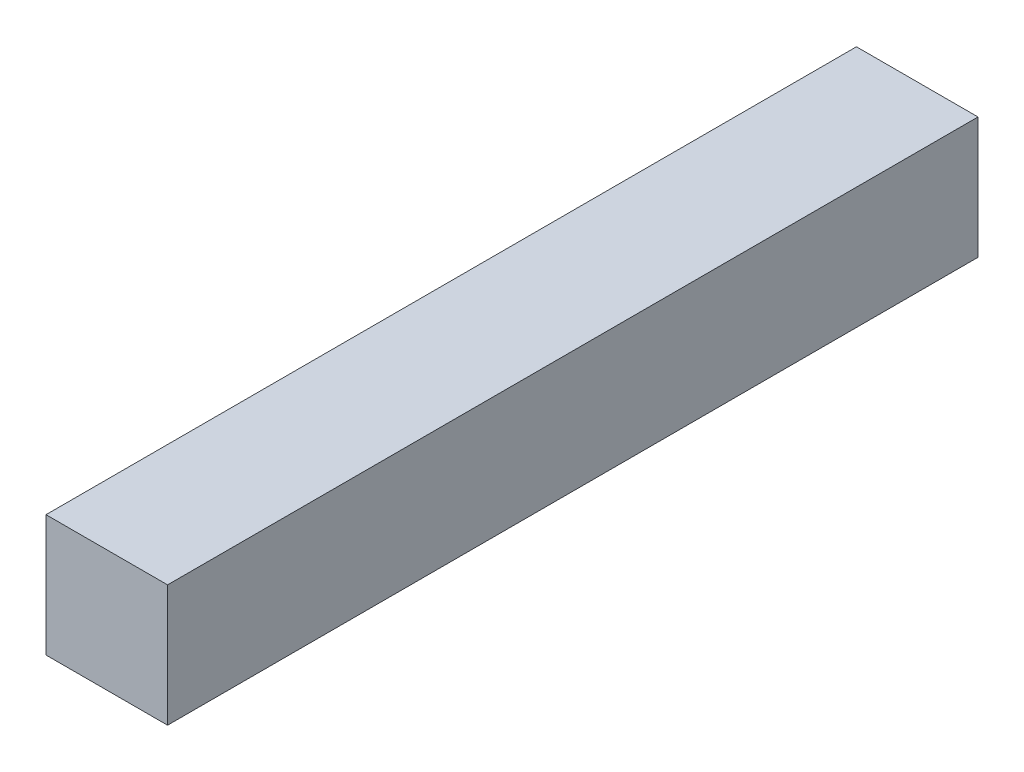
ISO-10303-21;
HEADER;
FILE_DESCRIPTION(('STEP AP214'),'2;1');
FILE_NAME('part.step','',(''),(''),'','','');
FILE_SCHEMA(('AUTOMOTIVE_DESIGN { 1 0 10303 214 1 1 1 1 }'));
ENDSEC;
DATA;
#1=APPLICATION_CONTEXT('core data for automotive mechanical design processes');
#2=APPLICATION_PROTOCOL_DEFINITION('international standard','automotive_design',2000,#1);
#3=PRODUCT_CONTEXT('',#1,'mechanical');
#4=PRODUCT('Part','Part','',(#3));
#5=PRODUCT_RELATED_PRODUCT_CATEGORY('part','',(#4));
#6=PRODUCT_DEFINITION_FORMATION('','',#4);
#7=PRODUCT_DEFINITION_CONTEXT('part definition',#1,'design');
#8=PRODUCT_DEFINITION('design','',#6,#7);
#9=PRODUCT_DEFINITION_SHAPE('','',#8);
#10=(LENGTH_UNIT() NAMED_UNIT(*) SI_UNIT(.MILLI.,.METRE.));
#11=(NAMED_UNIT(*) PLANE_ANGLE_UNIT() SI_UNIT($,.RADIAN.));
#12=(NAMED_UNIT(*) SI_UNIT($,.STERADIAN.) SOLID_ANGLE_UNIT());
#13=UNCERTAINTY_MEASURE_WITH_UNIT(LENGTH_MEASURE(1.E-05),#10,'distance_accuracy_value','');
#14=(GEOMETRIC_REPRESENTATION_CONTEXT(3) GLOBAL_UNCERTAINTY_ASSIGNED_CONTEXT((#13)) GLOBAL_UNIT_ASSIGNED_CONTEXT((#10,
#11,#12)) REPRESENTATION_CONTEXT('',''));
#15=CARTESIAN_POINT('',(0.,0.,0.));
#16=DIRECTION('',(0.,0.,1.));
#17=DIRECTION('',(1.,0.,0.));
#18=AXIS2_PLACEMENT_3D('',#15,#16,#17);
#19=CARTESIAN_POINT('',(-3.048,2.57628571428571,50.8));
#20=DIRECTION('',(1.,0.,0.));
#21=DIRECTION('',(0.,1.,0.));
#22=AXIS2_PLACEMENT_3D('',#19,#20,#21);
#23=PLANE('',#22);
#24=DIRECTION('',(0.,-1.,0.));
#25=VECTOR('',#24,1.);
#26=CARTESIAN_POINT('',(-3.048,2.57628571428571,0.));
#27=LINE('',#26,#25);
#28=CARTESIAN_POINT('',(-3.048,2.57628571428571,0.));
#29=VERTEX_POINT('',#28);
#30=CARTESIAN_POINT('',(-3.048,-5.04371428571429,0.));
#31=VERTEX_POINT('',#30);
#32=EDGE_CURVE('E107',#29,#31,#27,.T.);
#33=ORIENTED_EDGE('',*,*,#32,.T.);
#34=DIRECTION('',(0.,0.,-1.));
#35=VECTOR('',#34,1.);
#36=CARTESIAN_POINT('',(-3.048,-5.04371428571429,50.8));
#37=LINE('',#36,#35);
#38=CARTESIAN_POINT('',(-3.048,-5.04371428571429,50.8));
#39=VERTEX_POINT('',#38);
#40=EDGE_CURVE('E11',#39,#31,#37,.T.);
#41=ORIENTED_EDGE('',*,*,#40,.F.);
#42=DIRECTION('',(0.,-1.,0.));
#43=VECTOR('',#42,1.);
#44=CARTESIAN_POINT('',(-3.048,2.57628571428571,50.8));
#45=LINE('',#44,#43);
#46=CARTESIAN_POINT('',(-3.048,2.57628571428571,50.8));
#47=VERTEX_POINT('',#46);
#48=EDGE_CURVE('E91',#47,#39,#45,.T.);
#49=ORIENTED_EDGE('',*,*,#48,.F.);
#50=DIRECTION('',(0.,0.,-1.));
#51=VECTOR('',#50,1.);
#52=CARTESIAN_POINT('',(-3.048,2.57628571428571,50.8));
#53=LINE('',#52,#51);
#54=EDGE_CURVE('E103',#47,#29,#53,.T.);
#55=ORIENTED_EDGE('',*,*,#54,.T.);
#56=EDGE_LOOP('',(#33,#41,#49,#55));
#57=FACE_BOUND('',#56,.T.);
#58=ADVANCED_FACE('F39',(#57),#23,.F.);
#59=CARTESIAN_POINT('',(-3.048,-5.04371428571429,50.8));
#60=DIRECTION('',(0.,1.,0.));
#61=DIRECTION('',(0.,0.,1.));
#62=AXIS2_PLACEMENT_3D('',#59,#60,#61);
#63=PLANE('',#62);
#64=DIRECTION('',(1.,0.,0.));
#65=VECTOR('',#64,1.);
#66=CARTESIAN_POINT('',(-3.048,-5.04371428571429,0.));
#67=LINE('',#66,#65);
#68=CARTESIAN_POINT('',(4.572,-5.04371428571429,0.));
#69=VERTEX_POINT('',#68);
#70=EDGE_CURVE('E96',#31,#69,#67,.T.);
#71=ORIENTED_EDGE('',*,*,#70,.T.);
#72=DIRECTION('',(0.,0.,-1.));
#73=VECTOR('',#72,1.);
#74=CARTESIAN_POINT('',(4.572,-5.04371428571429,50.8));
#75=LINE('',#74,#73);
#76=CARTESIAN_POINT('',(4.572,-5.04371428571429,50.8));
#77=VERTEX_POINT('',#76);
#78=EDGE_CURVE('E48',#77,#69,#75,.T.);
#79=ORIENTED_EDGE('',*,*,#78,.F.);
#80=DIRECTION('',(1.,0.,0.));
#81=VECTOR('',#80,1.);
#82=CARTESIAN_POINT('',(-3.048,-5.04371428571429,50.8));
#83=LINE('',#82,#81);
#84=EDGE_CURVE('E86',#39,#77,#83,.T.);
#85=ORIENTED_EDGE('',*,*,#84,.F.);
#86=ORIENTED_EDGE('',*,*,#40,.T.);
#87=EDGE_LOOP('',(#71,#79,#85,#86));
#88=FACE_BOUND('',#87,.T.);
#89=ADVANCED_FACE('F95',(#88),#63,.F.);
#90=CARTESIAN_POINT('',(4.572,2.57628571428571,50.8));
#91=DIRECTION('',(-1.,0.,0.));
#92=DIRECTION('',(0.,-1.,0.));
#93=AXIS2_PLACEMENT_3D('',#90,#91,#92);
#94=PLANE('',#93);
#95=DIRECTION('',(0.,1.,0.));
#96=VECTOR('',#95,1.);
#97=CARTESIAN_POINT('',(4.572,2.57628571428571,0.));
#98=LINE('',#97,#96);
#99=CARTESIAN_POINT('',(4.572,2.57628571428571,0.));
#100=VERTEX_POINT('',#99);
#101=EDGE_CURVE('E73',#69,#100,#98,.T.);
#102=ORIENTED_EDGE('',*,*,#101,.T.);
#103=DIRECTION('',(0.,0.,-1.));
#104=VECTOR('',#103,1.);
#105=CARTESIAN_POINT('',(4.572,2.57628571428571,50.8));
#106=LINE('',#105,#104);
#107=CARTESIAN_POINT('',(4.572,2.57628571428571,50.8));
#108=VERTEX_POINT('',#107);
#109=EDGE_CURVE('E98',#108,#100,#106,.T.);
#110=ORIENTED_EDGE('',*,*,#109,.F.);
#111=DIRECTION('',(0.,1.,0.));
#112=VECTOR('',#111,1.);
#113=CARTESIAN_POINT('',(4.572,2.57628571428571,50.8));
#114=LINE('',#113,#112);
#115=EDGE_CURVE('E89',#77,#108,#114,.T.);
#116=ORIENTED_EDGE('',*,*,#115,.F.);
#117=ORIENTED_EDGE('',*,*,#78,.T.);
#118=EDGE_LOOP('',(#102,#110,#116,#117));
#119=FACE_BOUND('',#118,.T.);
#120=ADVANCED_FACE('F99',(#119),#94,.F.);
#121=CARTESIAN_POINT('',(-3.048,2.57628571428571,50.8));
#122=DIRECTION('',(0.,-1.,0.));
#123=DIRECTION('',(0.,0.,-1.));
#124=AXIS2_PLACEMENT_3D('',#121,#122,#123);
#125=PLANE('',#124);
#126=DIRECTION('',(-1.,0.,0.));
#127=VECTOR('',#126,1.);
#128=CARTESIAN_POINT('',(-3.048,2.57628571428571,0.));
#129=LINE('',#128,#127);
#130=EDGE_CURVE('E79',#100,#29,#129,.T.);
#131=ORIENTED_EDGE('',*,*,#130,.T.);
#132=ORIENTED_EDGE('',*,*,#54,.F.);
#133=DIRECTION('',(-1.,0.,0.));
#134=VECTOR('',#133,1.);
#135=CARTESIAN_POINT('',(-3.048,2.57628571428571,50.8));
#136=LINE('',#135,#134);
#137=EDGE_CURVE('E56',#108,#47,#136,.T.);
#138=ORIENTED_EDGE('',*,*,#137,.F.);
#139=ORIENTED_EDGE('',*,*,#109,.T.);
#140=EDGE_LOOP('',(#131,#132,#138,#139));
#141=FACE_BOUND('',#140,.T.);
#142=ADVANCED_FACE('F120',(#141),#125,.F.);
#143=CARTESIAN_POINT('',(0.,0.,50.8));
#144=DIRECTION('',(0.,0.,1.));
#145=DIRECTION('',(1.,0.,0.));
#146=AXIS2_PLACEMENT_3D('',#143,#144,#145);
#147=PLANE('',#146);
#148=ORIENTED_EDGE('',*,*,#48,.T.);
#149=ORIENTED_EDGE('',*,*,#84,.T.);
#150=ORIENTED_EDGE('',*,*,#115,.T.);
#151=ORIENTED_EDGE('',*,*,#137,.T.);
#152=EDGE_LOOP('',(#148,#149,#150,#151));
#153=FACE_BOUND('',#152,.T.);
#154=ADVANCED_FACE('F87',(#153),#147,.T.);
#155=CARTESIAN_POINT('',(0.,0.,0.));
#156=DIRECTION('',(0.,0.,1.));
#157=DIRECTION('',(1.,0.,0.));
#158=AXIS2_PLACEMENT_3D('',#155,#156,#157);
#159=PLANE('',#158);
#160=ORIENTED_EDGE('',*,*,#32,.F.);
#161=ORIENTED_EDGE('',*,*,#130,.F.);
#162=ORIENTED_EDGE('',*,*,#101,.F.);
#163=ORIENTED_EDGE('',*,*,#70,.F.);
#164=EDGE_LOOP('',(#160,#161,#162,#163));
#165=FACE_BOUND('',#164,.T.);
#166=ADVANCED_FACE('F123',(#165),#159,.F.);
#167=CLOSED_SHELL('',(#58,#89,#120,#142,#154,#166));
#168=MANIFOLD_SOLID_BREP('B2',#167);
#169=ADVANCED_BREP_SHAPE_REPRESENTATION('',(#18,#168),#14);
#170=SHAPE_DEFINITION_REPRESENTATION(#9,#169);
ENDSEC;
END-ISO-10303-21;
